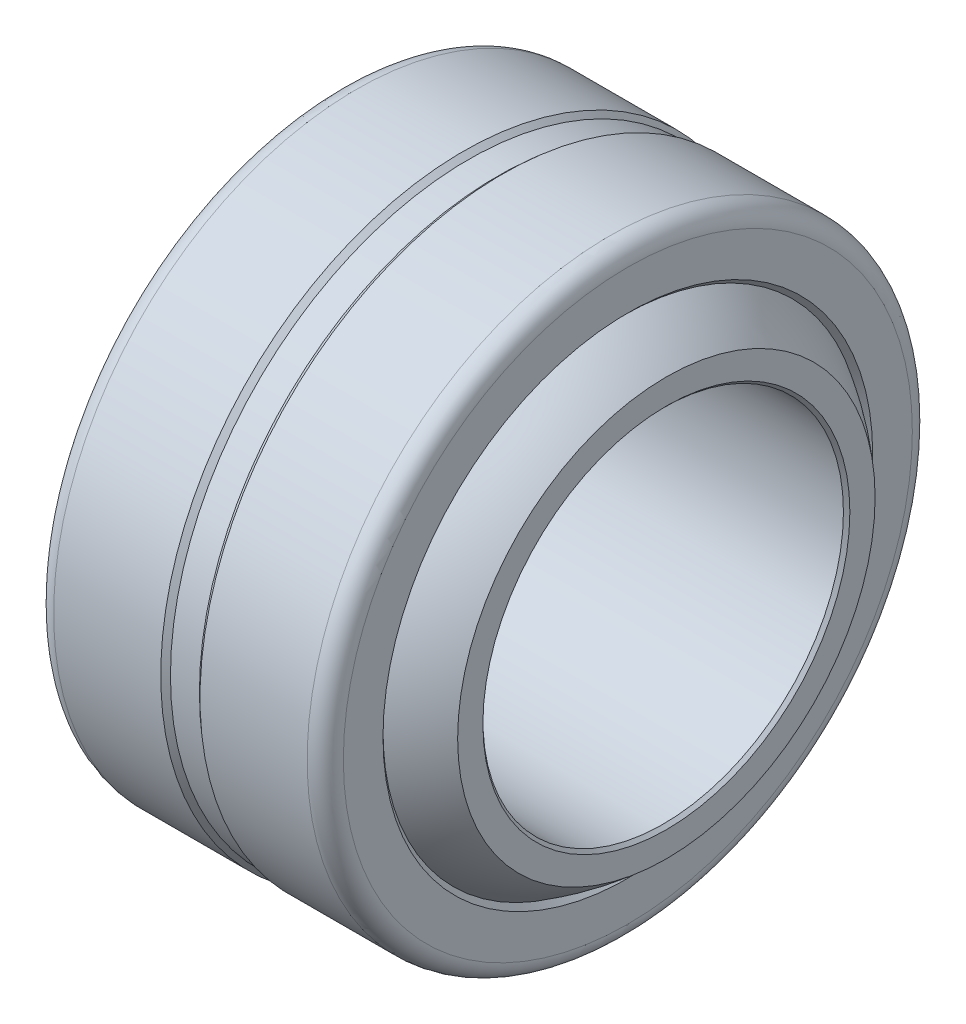
ISO-10303-21;
HEADER;
FILE_DESCRIPTION(('STEP AP214'),'2;1');
FILE_NAME('part.step','',(''),(''),'','','');
FILE_SCHEMA(('AUTOMOTIVE_DESIGN { 1 0 10303 214 1 1 1 1 }'));
ENDSEC;
DATA;
#1=APPLICATION_CONTEXT('core data for automotive mechanical design processes');
#2=APPLICATION_PROTOCOL_DEFINITION('international standard','automotive_design',2000,#1);
#3=PRODUCT_CONTEXT('',#1,'mechanical');
#4=PRODUCT('Part','Part','',(#3));
#5=PRODUCT_RELATED_PRODUCT_CATEGORY('part','',(#4));
#6=PRODUCT_DEFINITION_FORMATION('','',#4);
#7=PRODUCT_DEFINITION_CONTEXT('part definition',#1,'design');
#8=PRODUCT_DEFINITION('design','',#6,#7);
#9=PRODUCT_DEFINITION_SHAPE('','',#8);
#10=(LENGTH_UNIT() NAMED_UNIT(*) SI_UNIT(.MILLI.,.METRE.));
#11=(NAMED_UNIT(*) PLANE_ANGLE_UNIT() SI_UNIT($,.RADIAN.));
#12=(NAMED_UNIT(*) SI_UNIT($,.STERADIAN.) SOLID_ANGLE_UNIT());
#13=UNCERTAINTY_MEASURE_WITH_UNIT(LENGTH_MEASURE(1.E-05),#10,'distance_accuracy_value','');
#14=(GEOMETRIC_REPRESENTATION_CONTEXT(3) GLOBAL_UNCERTAINTY_ASSIGNED_CONTEXT((#13)) GLOBAL_UNIT_ASSIGNED_CONTEXT((#10,
#11,#12)) REPRESENTATION_CONTEXT('',''));
#15=CARTESIAN_POINT('',(0.,0.,0.));
#16=DIRECTION('',(0.,0.,1.));
#17=DIRECTION('',(1.,0.,0.));
#18=AXIS2_PLACEMENT_3D('',#15,#16,#17);
#19=CARTESIAN_POINT('',(0.,0.,0.));
#20=DIRECTION('',(1.,0.,0.));
#21=DIRECTION('',(0.,1.,0.));
#22=AXIS2_PLACEMENT_3D('',#19,#20,#21);
#23=SPHERICAL_SURFACE('',#22,68.5038);
#24=CARTESIAN_POINT('',(-45.212,0.,0.));
#25=DIRECTION('',(1.,0.,0.));
#26=DIRECTION('',(0.,0.,-1.));
#27=AXIS2_PLACEMENT_3D('',#24,#25,#26);
#28=CIRCLE('',#27,51.4649946122605);
#29=CARTESIAN_POINT('',(-45.212,51.4649946122605,0.));
#30=VERTEX_POINT('',#29);
#31=EDGE_CURVE('E10',#30,#30,#28,.T.);
#32=CARTESIAN_POINT('',(-34.5139774421506,0.,0.));
#33=DIRECTION('',(1.,0.,0.));
#34=DIRECTION('',(0.,0.,-1.));
#35=AXIS2_PLACEMENT_3D('',#32,#33,#34);
#36=CIRCLE('',#35,59.1739467634424);
#37=CARTESIAN_POINT('',(-34.5139774421506,59.1739467634424,0.));
#38=VERTEX_POINT('',#37);
#39=EDGE_CURVE('E89',#38,#38,#36,.T.);
#40=CARTESIAN_POINT('',(-45.212,51.4649946122605,0.));
#41=CARTESIAN_POINT('',(-45.1086481767401,51.5557892006684,0.));
#42=CARTESIAN_POINT('',(-45.0050228464585,51.6462724548895,0.));
#43=CARTESIAN_POINT('',(-44.7972289485432,51.8266130287342,0.));
#44=CARTESIAN_POINT('',(-44.6930603809094,51.9164703483577,0.));
#45=CARTESIAN_POINT('',(-44.4841837849806,52.0955557867833,0.));
#46=CARTESIAN_POINT('',(-44.3794757566856,52.1847839055853,0.));
#47=CARTESIAN_POINT('',(-44.1695240409886,52.3626077050689,0.));
#48=CARTESIAN_POINT('',(-44.0642803535867,52.4512033857503,0.));
#49=CARTESIAN_POINT('',(-43.8532611392566,52.6277590930169,0.));
#50=CARTESIAN_POINT('',(-43.7474856123284,52.7157191196021,0.));
#51=CARTESIAN_POINT('',(-43.5354065582093,52.8910003262091,0.));
#52=CARTESIAN_POINT('',(-43.4291030310183,52.9783215062309,0.));
#53=CARTESIAN_POINT('',(-43.2159718346994,53.1523218503141,0.));
#54=CARTESIAN_POINT('',(-43.1091441655715,53.2390010143756,0.));
#55=CARTESIAN_POINT('',(-42.8949685627559,53.411714180475,0.));
#56=CARTESIAN_POINT('',(-42.7876206290682,53.4977481825129,0.));
#57=CARTESIAN_POINT('',(-42.5724083933862,53.66916790191,0.));
#58=CARTESIAN_POINT('',(-42.4645440913918,53.7545536192692,0.));
#59=CARTESIAN_POINT('',(-42.2483030340934,53.924673670186,0.));
#60=CARTESIAN_POINT('',(-42.1399262787894,54.0094080037436,0.));
#61=CARTESIAN_POINT('',(-41.9226642484678,54.1782222115758,0.));
#62=CARTESIAN_POINT('',(-41.8137789734503,54.2623020858505,0.));
#63=CARTESIAN_POINT('',(-41.5955038557552,54.4298043233898,0.));
#64=CARTESIAN_POINT('',(-41.4861140130776,54.5132266866544,0.));
#65=CARTESIAN_POINT('',(-41.2668337304294,54.6794108743112,0.));
#66=CARTESIAN_POINT('',(-41.1569432904586,54.7621726987034,0.));
#67=CARTESIAN_POINT('',(-40.9366658017605,54.9270328047276,0.));
#68=CARTESIAN_POINT('',(-40.826278753033,55.0091310863595,0.));
#69=CARTESIAN_POINT('',(-40.6050120533825,55.1726611270592,0.));
#70=CARTESIAN_POINT('',(-40.4941324024594,55.2540928861268,0.));
#71=CARTESIAN_POINT('',(-40.2718845228579,55.4162869260855,0.));
#72=CARTESIAN_POINT('',(-40.1605162941796,55.4970492069766,0.));
#73=CARTESIAN_POINT('',(-39.9372953012412,55.6579013592689,0.));
#74=CARTESIAN_POINT('',(-39.8254425369811,55.7379912306701,0.));
#75=CARTESIAN_POINT('',(-39.6012565326394,55.8974956570751,0.));
#76=CARTESIAN_POINT('',(-39.4889232925578,55.9769102120788,0.));
#77=CARTESIAN_POINT('',(-39.2637804137721,56.135061123292,0.));
#78=CARTESIAN_POINT('',(-39.1509707750681,56.2137974795015,0.));
#79=CARTESIAN_POINT('',(-38.9248791935281,56.3705891353451,0.));
#80=CARTESIAN_POINT('',(-38.811597250692,56.4486444349793,0.));
#81=CARTESIAN_POINT('',(-38.584565172521,56.6040711446105,0.));
#82=CARTESIAN_POINT('',(-38.4708150371859,56.6814425546076,0.));
#83=CARTESIAN_POINT('',(-38.2428507026429,56.835498676725,0.));
#84=CARTESIAN_POINT('',(-38.1286365034351,56.9121833888453,0.));
#85=CARTESIAN_POINT('',(-37.8997481866162,57.0648633318939,0.));
#86=CARTESIAN_POINT('',(-37.7850740690052,57.140858562822,0.));
#87=CARTESIAN_POINT('',(-37.5552700775429,57.2921567851958,0.));
#88=CARTESIAN_POINT('',(-37.4401402036916,57.3674597766415,0.));
#89=CARTESIAN_POINT('',(-37.2094288784531,57.5173707868846,0.));
#90=CARTESIAN_POINT('',(-37.0938474270658,57.5919788056821,0.));
#91=CARTESIAN_POINT('',(-36.8622371418514,57.7404971626902,0.));
#92=CARTESIAN_POINT('',(-36.7462083080242,57.8144075009008,0.));
#93=CARTESIAN_POINT('',(-36.5137074692585,57.9615278141095,0.));
#94=CARTESIAN_POINT('',(-36.3972354643199,58.0347377891076,0.));
#95=CARTESIAN_POINT('',(-36.163852510766,58.1804547187217,0.));
#96=CARTESIAN_POINT('',(-36.0469415621508,58.2529616733376,0.));
#97=CARTESIAN_POINT('',(-35.8126849645311,58.3972699304007,0.));
#98=CARTESIAN_POINT('',(-35.6953393155267,58.4690712328477,0.));
#99=CARTESIAN_POINT('',(-35.4602175764885,58.6119655798965,0.));
#100=CARTESIAN_POINT('',(-35.3424414864547,58.6830586244983,0.));
#101=CARTESIAN_POINT('',(-35.1064631392414,58.8245338740274,0.));
#102=CARTESIAN_POINT('',(-34.9882608820618,58.8949160789549,0.));
#103=CARTESIAN_POINT('',(-34.7514344940112,59.0349671000449,0.));
#104=CARTESIAN_POINT('',(-34.6328103631401,59.1046359162075,0.));
#105=CARTESIAN_POINT('',(-34.5139774421506,59.1739467634424,0.));
#106=B_SPLINE_CURVE_WITH_KNOTS('',3,(#40,#41,#42,#43,#44,#45,#46,#47,#48,#49,#50,#51,#52,#53,
#54,#55,#56,#57,#58,#59,#60,#61,#62,#63,#64,#65,#66,#67,#68,#69,#70,#71,#72,#73,#74,#75,#76,#77,
#78,#79,#80,#81,#82,#83,#84,#85,#86,#87,#88,#89,#90,#91,#92,#93,#94,#95,#96,#97,#98,#99,#100,
#101,#102,#103,#104,#105),.UNSPECIFIED.,.F.,.F.,(4,2,2,2,2,2,2,2,2,2,2,2,2,2,2,2,2,2,2,2,2,2,2,
2,2,2,2,2,2,2,2,2,4),(0.,0.412706669005478,0.825413338010954,1.23812000701643,1.65082667602191,
2.06353334502739,2.47624001403286,2.88894668303834,3.30165335204382,3.7143600210493,
4.12706669005477,4.53977335906025,4.95248002806573,5.3651866970712,5.77789336607668,
6.19060003508217,6.60330670408764,7.01601337309311,7.4287200420986,7.84142671110407,
8.25413338010955,8.66684004911503,9.07954671812051,9.49225338712598,9.90496005613145,
10.3176667251369,10.7303733941424,11.1430800631479,11.5557867321534,11.9684934011588,
12.3812000701643,12.7939067391698,13.2066134081753),.UNSPECIFIED.);
#107=EDGE_CURVE('BSEAM31',#30,#38,#106,.T.);
#108=ORIENTED_EDGE('',*,*,#31,.T.);
#109=ORIENTED_EDGE('',*,*,#39,.F.);
#110=ORIENTED_EDGE('',*,*,#107,.T.);
#111=ORIENTED_EDGE('',*,*,#107,.F.);
#112=EDGE_LOOP('',(#108,#110,#109,#111));
#113=FACE_BOUND('',#112,.T.);
#114=ADVANCED_FACE('F31',(#113),#23,.T.);
#115=CARTESIAN_POINT('',(-45.212,51.4649946122605,0.));
#116=DIRECTION('',(-1.,0.,0.));
#117=DIRECTION('',(0.,0.,1.));
#118=AXIS2_PLACEMENT_3D('',#115,#116,#117);
#119=PLANE('',#118);
#120=CARTESIAN_POINT('',(-45.212,0.,0.));
#121=DIRECTION('',(1.,0.,0.));
#122=DIRECTION('',(0.,0.,-1.));
#123=AXIS2_PLACEMENT_3D('',#120,#121,#122);
#124=CIRCLE('',#123,45.2413850706692);
#125=CARTESIAN_POINT('',(-45.212,0.,-45.2413850706692));
#126=VERTEX_POINT('',#125);
#127=EDGE_CURVE('E37',#126,#126,#124,.T.);
#128=ORIENTED_EDGE('',*,*,#127,.T.);
#129=EDGE_LOOP('',(#128));
#130=FACE_BOUND('',#129,.T.);
#131=ORIENTED_EDGE('',*,*,#31,.F.);
#132=EDGE_LOOP('',(#131));
#133=FACE_BOUND('',#132,.T.);
#134=ADVANCED_FACE('F97',(#130,#133),#119,.T.);
#135=CARTESIAN_POINT('',(-45.212,0.,0.));
#136=DIRECTION('',(-1.,0.,0.));
#137=DIRECTION('',(0.,0.,1.));
#138=AXIS2_PLACEMENT_3D('',#135,#136,#137);
#139=CONICAL_SURFACE('',#138,45.2413850706692,0.785398163397448);
#140=CARTESIAN_POINT('',(-44.4206149293308,0.,0.));
#141=DIRECTION('',(1.,0.,0.));
#142=DIRECTION('',(0.,0.,-1.));
#143=AXIS2_PLACEMENT_3D('',#140,#141,#142);
#144=CIRCLE('',#143,44.45);
#145=CARTESIAN_POINT('',(-44.4206149293308,0.,-44.45));
#146=VERTEX_POINT('',#145);
#147=EDGE_CURVE('E41',#146,#146,#144,.T.);
#148=ORIENTED_EDGE('',*,*,#147,.T.);
#149=EDGE_LOOP('',(#148));
#150=FACE_BOUND('',#149,.T.);
#151=ORIENTED_EDGE('',*,*,#127,.F.);
#152=EDGE_LOOP('',(#151));
#153=FACE_BOUND('',#152,.T.);
#154=ADVANCED_FACE('F101',(#150,#153),#139,.F.);
#155=CARTESIAN_POINT('',(-45.212,0.,0.));
#156=DIRECTION('',(1.,0.,0.));
#157=DIRECTION('',(0.,0.,-1.));
#158=AXIS2_PLACEMENT_3D('',#155,#156,#157);
#159=CYLINDRICAL_SURFACE('',#158,44.45);
#160=CARTESIAN_POINT('',(44.4206149293308,0.,0.));
#161=DIRECTION('',(1.,0.,0.));
#162=DIRECTION('',(0.,0.,-1.));
#163=AXIS2_PLACEMENT_3D('',#160,#161,#162);
#164=CIRCLE('',#163,44.45);
#165=CARTESIAN_POINT('',(44.4206149293308,0.,-44.45));
#166=VERTEX_POINT('',#165);
#167=EDGE_CURVE('E45',#166,#166,#164,.T.);
#168=ORIENTED_EDGE('',*,*,#167,.T.);
#169=EDGE_LOOP('',(#168));
#170=FACE_BOUND('',#169,.T.);
#171=ORIENTED_EDGE('',*,*,#147,.F.);
#172=EDGE_LOOP('',(#171));
#173=FACE_BOUND('',#172,.T.);
#174=ADVANCED_FACE('F105',(#170,#173),#159,.F.);
#175=CARTESIAN_POINT('',(44.4206149293308,0.,0.));
#176=DIRECTION('',(1.,0.,0.));
#177=DIRECTION('',(0.,0.,-1.));
#178=AXIS2_PLACEMENT_3D('',#175,#176,#177);
#179=CONICAL_SURFACE('',#178,44.45,0.785398163397448);
#180=CARTESIAN_POINT('',(45.212,0.,0.));
#181=DIRECTION('',(1.,0.,0.));
#182=DIRECTION('',(0.,0.,-1.));
#183=AXIS2_PLACEMENT_3D('',#180,#181,#182);
#184=CIRCLE('',#183,45.2413850706692);
#185=CARTESIAN_POINT('',(45.212,0.,-45.2413850706692));
#186=VERTEX_POINT('',#185);
#187=EDGE_CURVE('E50',#186,#186,#184,.T.);
#188=ORIENTED_EDGE('',*,*,#187,.T.);
#189=EDGE_LOOP('',(#188));
#190=FACE_BOUND('',#189,.T.);
#191=ORIENTED_EDGE('',*,*,#167,.F.);
#192=EDGE_LOOP('',(#191));
#193=FACE_BOUND('',#192,.T.);
#194=ADVANCED_FACE('F112',(#190,#193),#179,.F.);
#195=CARTESIAN_POINT('',(45.212,45.2413850706692,0.));
#196=DIRECTION('',(1.,0.,0.));
#197=DIRECTION('',(0.,0.,-1.));
#198=AXIS2_PLACEMENT_3D('',#195,#196,#197);
#199=PLANE('',#198);
#200=CARTESIAN_POINT('',(45.212,0.,0.));
#201=DIRECTION('',(1.,0.,0.));
#202=DIRECTION('',(0.,0.,-1.));
#203=AXIS2_PLACEMENT_3D('',#200,#201,#202);
#204=CIRCLE('',#203,51.4649946122605);
#205=CARTESIAN_POINT('',(45.212,51.4649946122605,0.));
#206=VERTEX_POINT('',#205);
#207=EDGE_CURVE('E53',#206,#206,#204,.T.);
#208=ORIENTED_EDGE('',*,*,#207,.T.);
#209=EDGE_LOOP('',(#208));
#210=FACE_BOUND('',#209,.T.);
#211=ORIENTED_EDGE('',*,*,#187,.F.);
#212=EDGE_LOOP('',(#211));
#213=FACE_BOUND('',#212,.T.);
#214=ADVANCED_FACE('F116',(#210,#213),#199,.T.);
#215=CARTESIAN_POINT('',(0.,0.,0.));
#216=DIRECTION('',(1.,0.,0.));
#217=DIRECTION('',(0.,1.,0.));
#218=AXIS2_PLACEMENT_3D('',#215,#216,#217);
#219=SPHERICAL_SURFACE('',#218,68.5038);
#220=CARTESIAN_POINT('',(34.5139774421507,0.,0.));
#221=DIRECTION('',(1.,0.,0.));
#222=DIRECTION('',(0.,0.,-1.));
#223=AXIS2_PLACEMENT_3D('',#220,#221,#222);
#224=CIRCLE('',#223,59.1739467634424);
#225=CARTESIAN_POINT('',(34.5139774421507,59.1739467634424,0.));
#226=VERTEX_POINT('',#225);
#227=EDGE_CURVE('E56',#226,#226,#224,.T.);
#228=CARTESIAN_POINT('',(34.5139774421507,59.1739467634424,0.));
#229=CARTESIAN_POINT('',(34.6328103631402,59.1046359162075,0.));
#230=CARTESIAN_POINT('',(34.7514344940112,59.0349671000449,0.));
#231=CARTESIAN_POINT('',(34.9882608820619,58.8949160789548,0.));
#232=CARTESIAN_POINT('',(35.1064631392415,58.8245338740274,0.));
#233=CARTESIAN_POINT('',(35.3424414864548,58.6830586244982,0.));
#234=CARTESIAN_POINT('',(35.4602175764886,58.6119655798965,0.));
#235=CARTESIAN_POINT('',(35.6953393155268,58.4690712328477,0.));
#236=CARTESIAN_POINT('',(35.8126849645312,58.3972699304006,0.));
#237=CARTESIAN_POINT('',(36.0469415621509,58.2529616733376,0.));
#238=CARTESIAN_POINT('',(36.1638525107661,58.1804547187217,0.));
#239=CARTESIAN_POINT('',(36.39723546432,58.0347377891076,0.));
#240=CARTESIAN_POINT('',(36.5137074692585,57.9615278141095,0.));
#241=CARTESIAN_POINT('',(36.7462083080243,57.8144075009007,0.));
#242=CARTESIAN_POINT('',(36.8622371418514,57.7404971626901,0.));
#243=CARTESIAN_POINT('',(37.0938474270659,57.5919788056821,0.));
#244=CARTESIAN_POINT('',(37.2094288784531,57.5173707868846,0.));
#245=CARTESIAN_POINT('',(37.4401402036917,57.3674597766414,0.));
#246=CARTESIAN_POINT('',(37.555270077543,57.2921567851958,0.));
#247=CARTESIAN_POINT('',(37.7850740690053,57.140858562822,0.));
#248=CARTESIAN_POINT('',(37.8997481866163,57.0648633318938,0.));
#249=CARTESIAN_POINT('',(38.1286365034351,56.9121833888453,0.));
#250=CARTESIAN_POINT('',(38.242850702643,56.835498676725,0.));
#251=CARTESIAN_POINT('',(38.470815037186,56.6814425546075,0.));
#252=CARTESIAN_POINT('',(38.584565172521,56.6040711446105,0.));
#253=CARTESIAN_POINT('',(38.8115972506921,56.4486444349793,0.));
#254=CARTESIAN_POINT('',(38.9248791935281,56.3705891353451,0.));
#255=CARTESIAN_POINT('',(39.1509707750681,56.2137974795015,0.));
#256=CARTESIAN_POINT('',(39.2637804137722,56.135061123292,0.));
#257=CARTESIAN_POINT('',(39.4889232925578,55.9769102120788,0.));
#258=CARTESIAN_POINT('',(39.6012565326395,55.8974956570751,0.));
#259=CARTESIAN_POINT('',(39.8254425369812,55.7379912306701,0.));
#260=CARTESIAN_POINT('',(39.9372953012412,55.6579013592689,0.));
#261=CARTESIAN_POINT('',(40.1605162941796,55.4970492069766,0.));
#262=CARTESIAN_POINT('',(40.271884522858,55.4162869260855,0.));
#263=CARTESIAN_POINT('',(40.4941324024594,55.2540928861268,0.));
#264=CARTESIAN_POINT('',(40.6050120533825,55.1726611270592,0.));
#265=CARTESIAN_POINT('',(40.8262787530331,55.0091310863595,0.));
#266=CARTESIAN_POINT('',(40.9366658017605,54.9270328047276,0.));
#267=CARTESIAN_POINT('',(41.1569432904587,54.7621726987034,0.));
#268=CARTESIAN_POINT('',(41.2668337304294,54.6794108743112,0.));
#269=CARTESIAN_POINT('',(41.4861140130777,54.5132266866544,0.));
#270=CARTESIAN_POINT('',(41.5955038557552,54.4298043233898,0.));
#271=CARTESIAN_POINT('',(41.8137789734503,54.2623020858505,0.));
#272=CARTESIAN_POINT('',(41.9226642484678,54.1782222115758,0.));
#273=CARTESIAN_POINT('',(42.1399262787894,54.0094080037436,0.));
#274=CARTESIAN_POINT('',(42.2483030340934,53.924673670186,0.));
#275=CARTESIAN_POINT('',(42.4645440913918,53.7545536192692,0.));
#276=CARTESIAN_POINT('',(42.5724083933862,53.66916790191,0.));
#277=CARTESIAN_POINT('',(42.7876206290683,53.4977481825129,0.));
#278=CARTESIAN_POINT('',(42.8949685627559,53.411714180475,0.));
#279=CARTESIAN_POINT('',(43.1091441655715,53.2390010143756,0.));
#280=CARTESIAN_POINT('',(43.2159718346994,53.1523218503142,0.));
#281=CARTESIAN_POINT('',(43.4291030310183,52.9783215062309,0.));
#282=CARTESIAN_POINT('',(43.5354065582093,52.8910003262091,0.));
#283=CARTESIAN_POINT('',(43.7474856123284,52.7157191196021,0.));
#284=CARTESIAN_POINT('',(43.8532611392566,52.627759093017,0.));
#285=CARTESIAN_POINT('',(44.0642803535867,52.4512033857503,0.));
#286=CARTESIAN_POINT('',(44.1695240409886,52.3626077050689,0.));
#287=CARTESIAN_POINT('',(44.3794757566856,52.1847839055854,0.));
#288=CARTESIAN_POINT('',(44.4841837849806,52.0955557867833,0.));
#289=CARTESIAN_POINT('',(44.6930603809094,51.9164703483577,0.));
#290=CARTESIAN_POINT('',(44.7972289485432,51.8266130287342,0.));
#291=CARTESIAN_POINT('',(45.0050228464585,51.6462724548896,0.));
#292=CARTESIAN_POINT('',(45.1086481767401,51.5557892006684,0.));
#293=CARTESIAN_POINT('',(45.212,51.4649946122605,0.));
#294=B_SPLINE_CURVE_WITH_KNOTS('',3,(#228,#229,#230,#231,#232,#233,#234,#235,#236,#237,#238,
#239,#240,#241,#242,#243,#244,#245,#246,#247,#248,#249,#250,#251,#252,#253,#254,#255,#256,#257,
#258,#259,#260,#261,#262,#263,#264,#265,#266,#267,#268,#269,#270,#271,#272,#273,#274,#275,#276,
#277,#278,#279,#280,#281,#282,#283,#284,#285,#286,#287,#288,#289,#290,#291,#292,#293),
.UNSPECIFIED.,.F.,.F.,(4,2,2,2,2,2,2,2,2,2,2,2,2,2,2,2,2,2,2,2,2,2,2,2,2,2,2,2,2,2,2,2,4),(0.,
0.412706669005479,0.825413338010953,1.23812000701643,1.65082667602189,2.06353334502737,
2.47624001403284,2.88894668303831,3.30165335204378,3.71436002104925,4.12706669005473,
4.53977335906021,4.95248002806568,5.36518669707115,5.77789336607663,6.1906000350821,
6.60330670408757,7.01601337309305,7.42872004209852,7.841426711104,8.25413338010947,
8.66684004911494,9.07954671812041,9.49225338712588,9.90496005613135,10.3176667251368,
10.7303733941423,11.1430800631478,11.5557867321532,11.9684934011587,12.3812000701642,
12.7939067391697,13.2066134081751),.UNSPECIFIED.);
#295=EDGE_CURVE('BSEAM120',#226,#206,#294,.T.);
#296=ORIENTED_EDGE('',*,*,#227,.T.);
#297=ORIENTED_EDGE('',*,*,#207,.F.);
#298=ORIENTED_EDGE('',*,*,#295,.T.);
#299=ORIENTED_EDGE('',*,*,#295,.F.);
#300=EDGE_LOOP('',(#296,#298,#297,#299));
#301=FACE_BOUND('',#300,.T.);
#302=ADVANCED_FACE('F120',(#301),#219,.T.);
#303=CARTESIAN_POINT('',(34.5139774421507,0.,0.));
#304=DIRECTION('',(1.,0.,0.));
#305=DIRECTION('',(0.,0.,-1.));
#306=AXIS2_PLACEMENT_3D('',#303,#304,#305);
#307=CONICAL_SURFACE('',#306,59.1739467634424,0.785398163397492);
#308=CARTESIAN_POINT('',(35.7124,0.,0.));
#309=DIRECTION('',(1.,0.,0.));
#310=DIRECTION('',(0.,0.,-1.));
#311=AXIS2_PLACEMENT_3D('',#308,#309,#310);
#312=CIRCLE('',#311,60.3723693212918);
#313=CARTESIAN_POINT('',(35.7124,0.,-60.3723693212918));
#314=VERTEX_POINT('',#313);
#315=EDGE_CURVE('E59',#314,#314,#312,.T.);
#316=ORIENTED_EDGE('',*,*,#315,.T.);
#317=EDGE_LOOP('',(#316));
#318=FACE_BOUND('',#317,.T.);
#319=ORIENTED_EDGE('',*,*,#227,.F.);
#320=EDGE_LOOP('',(#319));
#321=FACE_BOUND('',#320,.T.);
#322=ADVANCED_FACE('F124',(#318,#321),#307,.F.);
#323=CARTESIAN_POINT('',(35.7124,60.3723693212918,0.));
#324=DIRECTION('',(1.,0.,0.));
#325=DIRECTION('',(0.,0.,-1.));
#326=AXIS2_PLACEMENT_3D('',#323,#324,#325);
#327=PLANE('',#326);
#328=CARTESIAN_POINT('',(35.7124,0.,0.));
#329=DIRECTION('',(1.,0.,0.));
#330=DIRECTION('',(0.,0.,-1.));
#331=AXIS2_PLACEMENT_3D('',#328,#329,#330);
#332=CIRCLE('',#331,70.14845);
#333=CARTESIAN_POINT('',(35.7124,0.,-70.14845));
#334=VERTEX_POINT('',#333);
#335=EDGE_CURVE('E62',#334,#334,#332,.T.);
#336=ORIENTED_EDGE('',*,*,#335,.T.);
#337=EDGE_LOOP('',(#336));
#338=FACE_BOUND('',#337,.T.);
#339=ORIENTED_EDGE('',*,*,#315,.F.);
#340=EDGE_LOOP('',(#339));
#341=FACE_BOUND('',#340,.T.);
#342=ADVANCED_FACE('F128',(#338,#341),#327,.T.);
#343=CARTESIAN_POINT('',(31.24835,0.,0.));
#344=DIRECTION('',(1.,0.,0.));
#345=DIRECTION('',(0.,0.,-1.));
#346=AXIS2_PLACEMENT_3D('',#343,#344,#345);
#347=TOROIDAL_SURFACE('',#346,70.14845,4.46405);
#348=CARTESIAN_POINT('',(31.24835,0.,0.));
#349=DIRECTION('',(1.,0.,0.));
#350=DIRECTION('',(0.,0.,-1.));
#351=AXIS2_PLACEMENT_3D('',#348,#349,#350);
#352=CIRCLE('',#351,74.6125);
#353=CARTESIAN_POINT('',(31.24835,0.,-74.6125));
#354=VERTEX_POINT('',#353);
#355=EDGE_CURVE('E65',#354,#354,#352,.T.);
#356=ORIENTED_EDGE('',*,*,#355,.T.);
#357=EDGE_LOOP('',(#356));
#358=FACE_BOUND('',#357,.T.);
#359=ORIENTED_EDGE('',*,*,#335,.F.);
#360=EDGE_LOOP('',(#359));
#361=FACE_BOUND('',#360,.T.);
#362=ADVANCED_FACE('F132',(#358,#361),#347,.T.);
#363=CARTESIAN_POINT('',(-45.212,0.,0.));
#364=DIRECTION('',(1.,0.,0.));
#365=DIRECTION('',(0.,0.,-1.));
#366=AXIS2_PLACEMENT_3D('',#363,#364,#365);
#367=CYLINDRICAL_SURFACE('',#366,74.6125);
#368=CARTESIAN_POINT('',(4.84397429833891,0.,0.));
#369=DIRECTION('',(1.,0.,0.));
#370=DIRECTION('',(0.,0.,-1.));
#371=AXIS2_PLACEMENT_3D('',#368,#369,#370);
#372=CIRCLE('',#371,74.6125);
#373=CARTESIAN_POINT('',(4.84397429833891,0.,-74.6125));
#374=VERTEX_POINT('',#373);
#375=EDGE_CURVE('E68',#374,#374,#372,.T.);
#376=ORIENTED_EDGE('',*,*,#375,.T.);
#377=EDGE_LOOP('',(#376));
#378=FACE_BOUND('',#377,.T.);
#379=ORIENTED_EDGE('',*,*,#355,.F.);
#380=EDGE_LOOP('',(#379));
#381=FACE_BOUND('',#380,.T.);
#382=ADVANCED_FACE('F136',(#378,#381),#367,.T.);
#383=CARTESIAN_POINT('',(4.84397429833891,0.,0.));
#384=DIRECTION('',(1.,0.,0.));
#385=DIRECTION('',(0.,0.,-1.));
#386=AXIS2_PLACEMENT_3D('',#383,#384,#385);
#387=CONICAL_SURFACE('',#386,74.6125,0.721292219971687);
#388=CARTESIAN_POINT('',(3.57124,0.,0.));
#389=DIRECTION('',(1.,0.,0.));
#390=DIRECTION('',(0.,0.,-1.));
#391=AXIS2_PLACEMENT_3D('',#388,#389,#390);
#392=CIRCLE('',#391,73.4933125);
#393=CARTESIAN_POINT('',(3.57124,0.,-73.4933125));
#394=VERTEX_POINT('',#393);
#395=EDGE_CURVE('E71',#394,#394,#392,.T.);
#396=ORIENTED_EDGE('',*,*,#395,.T.);
#397=EDGE_LOOP('',(#396));
#398=FACE_BOUND('',#397,.T.);
#399=ORIENTED_EDGE('',*,*,#375,.F.);
#400=EDGE_LOOP('',(#399));
#401=FACE_BOUND('',#400,.T.);
#402=ADVANCED_FACE('F140',(#398,#401),#387,.T.);
#403=CARTESIAN_POINT('',(-45.212,0.,0.));
#404=DIRECTION('',(1.,0.,0.));
#405=DIRECTION('',(0.,0.,-1.));
#406=AXIS2_PLACEMENT_3D('',#403,#404,#405);
#407=CYLINDRICAL_SURFACE('',#406,73.4933125);
#408=CARTESIAN_POINT('',(-3.57124,0.,0.));
#409=DIRECTION('',(1.,0.,0.));
#410=DIRECTION('',(0.,0.,-1.));
#411=AXIS2_PLACEMENT_3D('',#408,#409,#410);
#412=CIRCLE('',#411,73.4933125);
#413=CARTESIAN_POINT('',(-3.57124,0.,-73.4933125));
#414=VERTEX_POINT('',#413);
#415=EDGE_CURVE('E74',#414,#414,#412,.T.);
#416=ORIENTED_EDGE('',*,*,#415,.T.);
#417=EDGE_LOOP('',(#416));
#418=FACE_BOUND('',#417,.T.);
#419=ORIENTED_EDGE('',*,*,#395,.F.);
#420=EDGE_LOOP('',(#419));
#421=FACE_BOUND('',#420,.T.);
#422=ADVANCED_FACE('F144',(#418,#421),#407,.T.);
#423=CARTESIAN_POINT('',(-3.57124,0.,0.));
#424=DIRECTION('',(-1.,0.,0.));
#425=DIRECTION('',(0.,0.,1.));
#426=AXIS2_PLACEMENT_3D('',#423,#424,#425);
#427=CONICAL_SURFACE('',#426,73.4933125,0.721292219971696);
#428=CARTESIAN_POINT('',(-4.8439742983389,0.,0.));
#429=DIRECTION('',(1.,0.,0.));
#430=DIRECTION('',(0.,0.,-1.));
#431=AXIS2_PLACEMENT_3D('',#428,#429,#430);
#432=CIRCLE('',#431,74.6125);
#433=CARTESIAN_POINT('',(-4.8439742983389,0.,-74.6125));
#434=VERTEX_POINT('',#433);
#435=EDGE_CURVE('E77',#434,#434,#432,.T.);
#436=ORIENTED_EDGE('',*,*,#435,.T.);
#437=EDGE_LOOP('',(#436));
#438=FACE_BOUND('',#437,.T.);
#439=ORIENTED_EDGE('',*,*,#415,.F.);
#440=EDGE_LOOP('',(#439));
#441=FACE_BOUND('',#440,.T.);
#442=ADVANCED_FACE('F148',(#438,#441),#427,.T.);
#443=CARTESIAN_POINT('',(-45.212,0.,0.));
#444=DIRECTION('',(1.,0.,0.));
#445=DIRECTION('',(0.,0.,-1.));
#446=AXIS2_PLACEMENT_3D('',#443,#444,#445);
#447=CYLINDRICAL_SURFACE('',#446,74.6125);
#448=CARTESIAN_POINT('',(-31.24835,0.,0.));
#449=DIRECTION('',(1.,0.,0.));
#450=DIRECTION('',(0.,0.,-1.));
#451=AXIS2_PLACEMENT_3D('',#448,#449,#450);
#452=CIRCLE('',#451,74.6125);
#453=CARTESIAN_POINT('',(-31.24835,0.,-74.6125));
#454=VERTEX_POINT('',#453);
#455=EDGE_CURVE('E80',#454,#454,#452,.T.);
#456=ORIENTED_EDGE('',*,*,#455,.T.);
#457=EDGE_LOOP('',(#456));
#458=FACE_BOUND('',#457,.T.);
#459=ORIENTED_EDGE('',*,*,#435,.F.);
#460=EDGE_LOOP('',(#459));
#461=FACE_BOUND('',#460,.T.);
#462=ADVANCED_FACE('F152',(#458,#461),#447,.T.);
#463=CARTESIAN_POINT('',(-31.24835,0.,0.));
#464=DIRECTION('',(1.,0.,0.));
#465=DIRECTION('',(0.,0.,-1.));
#466=AXIS2_PLACEMENT_3D('',#463,#464,#465);
#467=TOROIDAL_SURFACE('',#466,70.14845,4.46405);
#468=CARTESIAN_POINT('',(-35.7124,0.,0.));
#469=DIRECTION('',(1.,0.,0.));
#470=DIRECTION('',(0.,0.,-1.));
#471=AXIS2_PLACEMENT_3D('',#468,#469,#470);
#472=CIRCLE('',#471,70.14845);
#473=CARTESIAN_POINT('',(-35.7124,0.,-70.14845));
#474=VERTEX_POINT('',#473);
#475=EDGE_CURVE('E83',#474,#474,#472,.T.);
#476=ORIENTED_EDGE('',*,*,#475,.T.);
#477=EDGE_LOOP('',(#476));
#478=FACE_BOUND('',#477,.T.);
#479=ORIENTED_EDGE('',*,*,#455,.F.);
#480=EDGE_LOOP('',(#479));
#481=FACE_BOUND('',#480,.T.);
#482=ADVANCED_FACE('F156',(#478,#481),#467,.T.);
#483=CARTESIAN_POINT('',(-35.7124,70.14845,0.));
#484=DIRECTION('',(-1.,0.,0.));
#485=DIRECTION('',(0.,0.,1.));
#486=AXIS2_PLACEMENT_3D('',#483,#484,#485);
#487=PLANE('',#486);
#488=CARTESIAN_POINT('',(-35.7124,0.,0.));
#489=DIRECTION('',(1.,0.,0.));
#490=DIRECTION('',(0.,0.,-1.));
#491=AXIS2_PLACEMENT_3D('',#488,#489,#490);
#492=CIRCLE('',#491,60.3723693212918);
#493=CARTESIAN_POINT('',(-35.7124,0.,-60.3723693212918));
#494=VERTEX_POINT('',#493);
#495=EDGE_CURVE('E86',#494,#494,#492,.T.);
#496=ORIENTED_EDGE('',*,*,#495,.T.);
#497=EDGE_LOOP('',(#496));
#498=FACE_BOUND('',#497,.T.);
#499=ORIENTED_EDGE('',*,*,#475,.F.);
#500=EDGE_LOOP('',(#499));
#501=FACE_BOUND('',#500,.T.);
#502=ADVANCED_FACE('F160',(#498,#501),#487,.T.);
#503=CARTESIAN_POINT('',(-35.7124,0.,0.));
#504=DIRECTION('',(-1.,0.,0.));
#505=DIRECTION('',(0.,0.,1.));
#506=AXIS2_PLACEMENT_3D('',#503,#504,#505);
#507=CONICAL_SURFACE('',#506,60.3723693212918,0.785398163397451);
#508=ORIENTED_EDGE('',*,*,#39,.T.);
#509=EDGE_LOOP('',(#508));
#510=FACE_BOUND('',#509,.T.);
#511=ORIENTED_EDGE('',*,*,#495,.F.);
#512=EDGE_LOOP('',(#511));
#513=FACE_BOUND('',#512,.T.);
#514=ADVANCED_FACE('F93',(#510,#513),#507,.F.);
#515=CLOSED_SHELL('',(#114,#134,#154,#174,#194,#214,#302,#322,#342,#362,#382,#402,#422,#442,
#462,#482,#502,#514));
#516=MANIFOLD_SOLID_BREP('B2',#515);
#517=ADVANCED_BREP_SHAPE_REPRESENTATION('',(#18,#516),#14);
#518=SHAPE_DEFINITION_REPRESENTATION(#9,#517);
ENDSEC;
END-ISO-10303-21;
